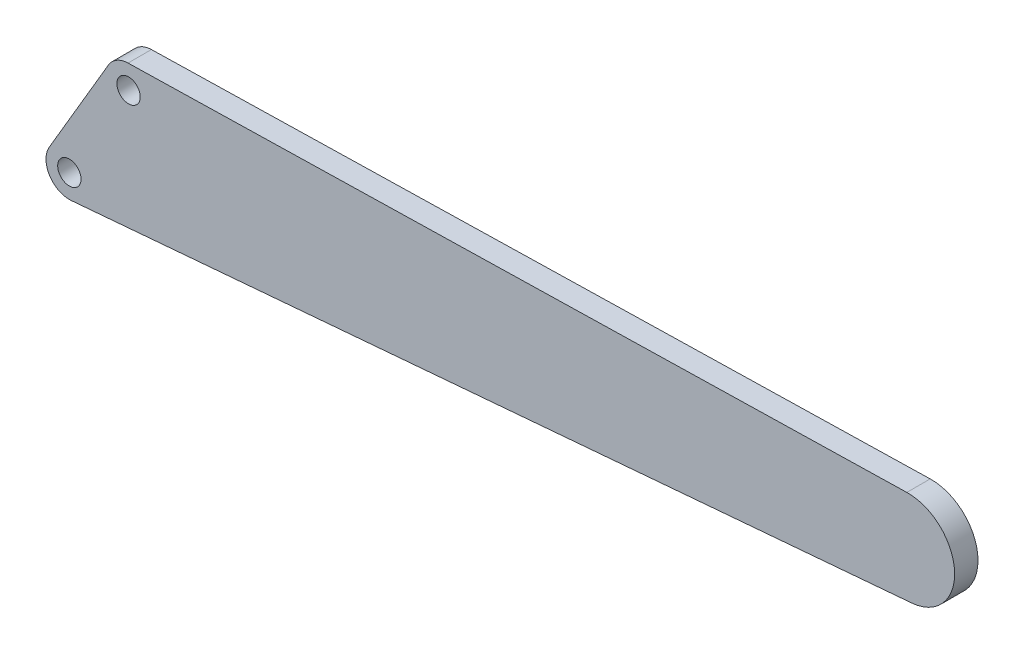
ISO-10303-21;
HEADER;
FILE_DESCRIPTION(('STEP AP214'),'2;1');
FILE_NAME('part.step','',(''),(''),'','','');
FILE_SCHEMA(('AUTOMOTIVE_DESIGN { 1 0 10303 214 1 1 1 1 }'));
ENDSEC;
DATA;
#1=APPLICATION_CONTEXT('core data for automotive mechanical design processes');
#2=APPLICATION_PROTOCOL_DEFINITION('international standard','automotive_design',2000,#1);
#3=PRODUCT_CONTEXT('',#1,'mechanical');
#4=PRODUCT('Part','Part','',(#3));
#5=PRODUCT_RELATED_PRODUCT_CATEGORY('part','',(#4));
#6=PRODUCT_DEFINITION_FORMATION('','',#4);
#7=PRODUCT_DEFINITION_CONTEXT('part definition',#1,'design');
#8=PRODUCT_DEFINITION('design','',#6,#7);
#9=PRODUCT_DEFINITION_SHAPE('','',#8);
#10=(LENGTH_UNIT() NAMED_UNIT(*) SI_UNIT(.MILLI.,.METRE.));
#11=(NAMED_UNIT(*) PLANE_ANGLE_UNIT() SI_UNIT($,.RADIAN.));
#12=(NAMED_UNIT(*) SI_UNIT($,.STERADIAN.) SOLID_ANGLE_UNIT());
#13=UNCERTAINTY_MEASURE_WITH_UNIT(LENGTH_MEASURE(1.E-05),#10,'distance_accuracy_value','');
#14=(GEOMETRIC_REPRESENTATION_CONTEXT(3) GLOBAL_UNCERTAINTY_ASSIGNED_CONTEXT((#13)) GLOBAL_UNIT_ASSIGNED_CONTEXT((#10,
#11,#12)) REPRESENTATION_CONTEXT('',''));
#15=CARTESIAN_POINT('',(0.,0.,0.));
#16=DIRECTION('',(0.,0.,1.));
#17=DIRECTION('',(1.,0.,0.));
#18=AXIS2_PLACEMENT_3D('',#15,#16,#17);
#19=CARTESIAN_POINT('',(0.,0.,3.));
#20=DIRECTION('',(0.,0.,1.));
#21=DIRECTION('',(1.,0.,0.));
#22=AXIS2_PLACEMENT_3D('',#19,#20,#21);
#23=PLANE('',#22);
#24=CARTESIAN_POINT('',(-7.59679952394698,-12.9340108625654,3.));
#25=DIRECTION('',(0.,0.,1.));
#26=DIRECTION('',(1.,0.,0.));
#27=AXIS2_PLACEMENT_3D('',#24,#25,#26);
#28=CIRCLE('',#27,1.5);
#29=CARTESIAN_POINT('',(-6.09679952394698,-12.9340108625654,3.));
#30=VERTEX_POINT('',#29);
#31=EDGE_CURVE('E125',#30,#30,#28,.T.);
#32=ORIENTED_EDGE('',*,*,#31,.F.);
#33=EDGE_LOOP('',(#32));
#34=FACE_BOUND('',#33,.T.);
#35=CARTESIAN_POINT('',(0.,0.,3.));
#36=DIRECTION('',(0.,0.,1.));
#37=DIRECTION('',(1.,0.,0.));
#38=AXIS2_PLACEMENT_3D('',#35,#36,#37);
#39=CIRCLE('',#38,3.);
#40=CARTESIAN_POINT('',(-0.0676018753305609,2.99923823436082,3.));
#41=VERTEX_POINT('',#40);
#42=CARTESIAN_POINT('',(-2.58680217251307,1.5193599047894,3.));
#43=VERTEX_POINT('',#42);
#44=EDGE_CURVE('E132',#41,#43,#39,.T.);
#45=ORIENTED_EDGE('',*,*,#44,.T.);
#46=DIRECTION('',(-0.506453301596465,-0.862267390837691,0.));
#47=VECTOR('',#46,1.);
#48=CARTESIAN_POINT('',(-10.1836016964601,-11.414650957776,3.));
#49=LINE('',#48,#47);
#50=CARTESIAN_POINT('',(-10.1836016964601,-11.414650957776,3.));
#51=VERTEX_POINT('',#50);
#52=EDGE_CURVE('E90',#43,#51,#49,.T.);
#53=ORIENTED_EDGE('',*,*,#52,.T.);
#54=CARTESIAN_POINT('',(-7.59679952394698,-12.9340108625654,3.));
#55=DIRECTION('',(0.,0.,1.));
#56=DIRECTION('',(1.,0.,0.));
#57=AXIS2_PLACEMENT_3D('',#54,#55,#56);
#58=CIRCLE('',#57,3.);
#59=CARTESIAN_POINT('',(-7.34187179294178,-15.9231598805912,3.));
#60=VERTEX_POINT('',#59);
#61=EDGE_CURVE('E103',#51,#60,#58,.T.);
#62=ORIENTED_EDGE('',*,*,#61,.T.);
#63=DIRECTION('',(0.996383006008596,0.0849759103350688,0.));
#64=VECTOR('',#63,1.);
#65=CARTESIAN_POINT('',(100.50985546201,-6.72509181898067,3.));
#66=LINE('',#65,#64);
#67=CARTESIAN_POINT('',(100.50985546201,-6.72509181898068,3.));
#68=VERTEX_POINT('',#67);
#69=EDGE_CURVE('E97',#60,#68,#66,.T.);
#70=ORIENTED_EDGE('',*,*,#69,.T.);
#71=CARTESIAN_POINT('',(100.,-0.746793782929099,3.));
#72=DIRECTION('',(0.,0.,1.));
#73=DIRECTION('',(1.,0.,0.));
#74=AXIS2_PLACEMENT_3D('',#71,#72,#73);
#75=CIRCLE('',#74,6.);
#76=CARTESIAN_POINT('',(99.8647962493389,5.25168268579253,3.));
#77=VERTEX_POINT('',#76);
#78=EDGE_CURVE('E101',#68,#77,#75,.T.);
#79=ORIENTED_EDGE('',*,*,#78,.T.);
#80=DIRECTION('',(-0.999746078120272,-0.0225339584435203,0.));
#81=VECTOR('',#80,1.);
#82=CARTESIAN_POINT('',(-0.0676018753305609,2.99923823436082,3.));
#83=LINE('',#82,#81);
#84=EDGE_CURVE('E53',#77,#41,#83,.T.);
#85=ORIENTED_EDGE('',*,*,#84,.T.);
#86=EDGE_LOOP('',(#45,#53,#62,#70,#79,#85));
#87=FACE_BOUND('',#86,.T.);
#88=CARTESIAN_POINT('',(0.,0.,3.));
#89=DIRECTION('',(0.,0.,1.));
#90=DIRECTION('',(1.,0.,0.));
#91=AXIS2_PLACEMENT_3D('',#88,#89,#90);
#92=CIRCLE('',#91,1.5);
#93=CARTESIAN_POINT('',(1.5,0.,3.));
#94=VERTEX_POINT('',#93);
#95=EDGE_CURVE('E174',#94,#94,#92,.T.);
#96=ORIENTED_EDGE('',*,*,#95,.F.);
#97=EDGE_LOOP('',(#96));
#98=FACE_BOUND('',#97,.T.);
#99=ADVANCED_FACE('F36',(#34,#87,#98),#23,.T.);
#100=CARTESIAN_POINT('',(0.,0.,0.));
#101=DIRECTION('',(0.,0.,1.));
#102=DIRECTION('',(1.,0.,0.));
#103=AXIS2_PLACEMENT_3D('',#100,#101,#102);
#104=PLANE('',#103);
#105=CARTESIAN_POINT('',(0.,0.,0.));
#106=DIRECTION('',(0.,0.,1.));
#107=DIRECTION('',(1.,0.,0.));
#108=AXIS2_PLACEMENT_3D('',#105,#106,#107);
#109=CIRCLE('',#108,3.);
#110=CARTESIAN_POINT('',(-0.0676018753305609,2.99923823436082,0.));
#111=VERTEX_POINT('',#110);
#112=CARTESIAN_POINT('',(-2.58680217251307,1.5193599047894,0.));
#113=VERTEX_POINT('',#112);
#114=EDGE_CURVE('E121',#111,#113,#109,.T.);
#115=ORIENTED_EDGE('',*,*,#114,.F.);
#116=DIRECTION('',(-0.999746078120272,-0.0225339584435203,0.));
#117=VECTOR('',#116,1.);
#118=CARTESIAN_POINT('',(-0.0676018753305609,2.99923823436082,0.));
#119=LINE('',#118,#117);
#120=CARTESIAN_POINT('',(99.8647962493389,5.25168268579253,0.));
#121=VERTEX_POINT('',#120);
#122=EDGE_CURVE('E82',#121,#111,#119,.T.);
#123=ORIENTED_EDGE('',*,*,#122,.F.);
#124=CARTESIAN_POINT('',(100.,-0.746793782929099,0.));
#125=DIRECTION('',(0.,0.,1.));
#126=DIRECTION('',(1.,0.,0.));
#127=AXIS2_PLACEMENT_3D('',#124,#125,#126);
#128=CIRCLE('',#127,6.);
#129=CARTESIAN_POINT('',(100.50985546201,-6.72509181898068,0.));
#130=VERTEX_POINT('',#129);
#131=EDGE_CURVE('E76',#130,#121,#128,.T.);
#132=ORIENTED_EDGE('',*,*,#131,.F.);
#133=DIRECTION('',(0.996383006008596,0.0849759103350688,0.));
#134=VECTOR('',#133,1.);
#135=CARTESIAN_POINT('',(100.50985546201,-6.72509181898067,0.));
#136=LINE('',#135,#134);
#137=CARTESIAN_POINT('',(-7.34187179294178,-15.9231598805912,0.));
#138=VERTEX_POINT('',#137);
#139=EDGE_CURVE('E111',#138,#130,#136,.T.);
#140=ORIENTED_EDGE('',*,*,#139,.F.);
#141=CARTESIAN_POINT('',(-7.59679952394698,-12.9340108625654,0.));
#142=DIRECTION('',(0.,0.,1.));
#143=DIRECTION('',(1.,0.,0.));
#144=AXIS2_PLACEMENT_3D('',#141,#142,#143);
#145=CIRCLE('',#144,3.);
#146=CARTESIAN_POINT('',(-10.1836016964601,-11.414650957776,0.));
#147=VERTEX_POINT('',#146);
#148=EDGE_CURVE('E127',#147,#138,#145,.T.);
#149=ORIENTED_EDGE('',*,*,#148,.F.);
#150=DIRECTION('',(-0.506453301596465,-0.862267390837691,0.));
#151=VECTOR('',#150,1.);
#152=CARTESIAN_POINT('',(-10.1836016964601,-11.414650957776,0.));
#153=LINE('',#152,#151);
#154=EDGE_CURVE('E124',#113,#147,#153,.T.);
#155=ORIENTED_EDGE('',*,*,#154,.F.);
#156=EDGE_LOOP('',(#115,#123,#132,#140,#149,#155));
#157=FACE_BOUND('',#156,.T.);
#158=CARTESIAN_POINT('',(-7.59679952394698,-12.9340108625654,0.));
#159=DIRECTION('',(0.,0.,1.));
#160=DIRECTION('',(1.,0.,0.));
#161=AXIS2_PLACEMENT_3D('',#158,#159,#160);
#162=CIRCLE('',#161,1.5);
#163=CARTESIAN_POINT('',(-6.09679952394698,-12.9340108625654,0.));
#164=VERTEX_POINT('',#163);
#165=EDGE_CURVE('E180',#164,#164,#162,.T.);
#166=ORIENTED_EDGE('',*,*,#165,.T.);
#167=EDGE_LOOP('',(#166));
#168=FACE_BOUND('',#167,.T.);
#169=CARTESIAN_POINT('',(0.,0.,0.));
#170=DIRECTION('',(0.,0.,1.));
#171=DIRECTION('',(1.,0.,0.));
#172=AXIS2_PLACEMENT_3D('',#169,#170,#171);
#173=CIRCLE('',#172,1.5);
#174=CARTESIAN_POINT('',(1.5,0.,0.));
#175=VERTEX_POINT('',#174);
#176=EDGE_CURVE('E177',#175,#175,#173,.T.);
#177=ORIENTED_EDGE('',*,*,#176,.T.);
#178=EDGE_LOOP('',(#177));
#179=FACE_BOUND('',#178,.T.);
#180=ADVANCED_FACE('F141',(#157,#168,#179),#104,.F.);
#181=CARTESIAN_POINT('',(0.,0.,3.));
#182=DIRECTION('',(0.,0.,-1.));
#183=DIRECTION('',(-1.,0.,0.));
#184=AXIS2_PLACEMENT_3D('',#181,#182,#183);
#185=CYLINDRICAL_SURFACE('',#184,3.);
#186=ORIENTED_EDGE('',*,*,#114,.T.);
#187=DIRECTION('',(0.,0.,-1.));
#188=VECTOR('',#187,1.);
#189=CARTESIAN_POINT('',(-2.58680217251307,1.5193599047894,3.));
#190=LINE('',#189,#188);
#191=EDGE_CURVE('E11',#43,#113,#190,.T.);
#192=ORIENTED_EDGE('',*,*,#191,.F.);
#193=ORIENTED_EDGE('',*,*,#44,.F.);
#194=DIRECTION('',(0.,0.,-1.));
#195=VECTOR('',#194,1.);
#196=CARTESIAN_POINT('',(-0.0676018753305609,2.99923823436082,3.));
#197=LINE('',#196,#195);
#198=EDGE_CURVE('E117',#41,#111,#197,.T.);
#199=ORIENTED_EDGE('',*,*,#198,.T.);
#200=EDGE_LOOP('',(#186,#192,#193,#199));
#201=FACE_BOUND('',#200,.T.);
#202=ADVANCED_FACE('F38',(#201),#185,.T.);
#203=CARTESIAN_POINT('',(-10.1836016964601,-11.414650957776,3.));
#204=DIRECTION('',(0.862267390837691,-0.506453301596465,0.));
#205=DIRECTION('',(0.506453301596465,0.862267390837691,0.));
#206=AXIS2_PLACEMENT_3D('',#203,#204,#205);
#207=PLANE('',#206);
#208=ORIENTED_EDGE('',*,*,#154,.T.);
#209=DIRECTION('',(0.,0.,-1.));
#210=VECTOR('',#209,1.);
#211=CARTESIAN_POINT('',(-10.1836016964601,-11.414650957776,3.));
#212=LINE('',#211,#210);
#213=EDGE_CURVE('E45',#51,#147,#212,.T.);
#214=ORIENTED_EDGE('',*,*,#213,.F.);
#215=ORIENTED_EDGE('',*,*,#52,.F.);
#216=ORIENTED_EDGE('',*,*,#191,.T.);
#217=EDGE_LOOP('',(#208,#214,#215,#216));
#218=FACE_BOUND('',#217,.T.);
#219=ADVANCED_FACE('F221',(#218),#207,.F.);
#220=CARTESIAN_POINT('',(-7.59679952394698,-12.9340108625654,3.));
#221=DIRECTION('',(0.,0.,-1.));
#222=DIRECTION('',(-1.,0.,0.));
#223=AXIS2_PLACEMENT_3D('',#220,#221,#222);
#224=CYLINDRICAL_SURFACE('',#223,3.);
#225=ORIENTED_EDGE('',*,*,#148,.T.);
#226=DIRECTION('',(0.,0.,-1.));
#227=VECTOR('',#226,1.);
#228=CARTESIAN_POINT('',(-7.34187179294178,-15.9231598805912,3.));
#229=LINE('',#228,#227);
#230=EDGE_CURVE('E112',#60,#138,#229,.T.);
#231=ORIENTED_EDGE('',*,*,#230,.F.);
#232=ORIENTED_EDGE('',*,*,#61,.F.);
#233=ORIENTED_EDGE('',*,*,#213,.T.);
#234=EDGE_LOOP('',(#225,#231,#232,#233));
#235=FACE_BOUND('',#234,.T.);
#236=ADVANCED_FACE('F138',(#235),#224,.T.);
#237=CARTESIAN_POINT('',(100.50985546201,-6.72509181898067,3.));
#238=DIRECTION('',(-0.0849759103350688,0.996383006008596,0.));
#239=DIRECTION('',(-0.996383006008596,-0.0849759103350688,0.));
#240=AXIS2_PLACEMENT_3D('',#237,#238,#239);
#241=PLANE('',#240);
#242=ORIENTED_EDGE('',*,*,#139,.T.);
#243=DIRECTION('',(0.,0.,-1.));
#244=VECTOR('',#243,1.);
#245=CARTESIAN_POINT('',(100.50985546201,-6.72509181898068,3.));
#246=LINE('',#245,#244);
#247=EDGE_CURVE('E108',#68,#130,#246,.T.);
#248=ORIENTED_EDGE('',*,*,#247,.F.);
#249=ORIENTED_EDGE('',*,*,#69,.F.);
#250=ORIENTED_EDGE('',*,*,#230,.T.);
#251=EDGE_LOOP('',(#242,#248,#249,#250));
#252=FACE_BOUND('',#251,.T.);
#253=ADVANCED_FACE('F109',(#252),#241,.F.);
#254=CARTESIAN_POINT('',(100.,-0.746793782929099,3.));
#255=DIRECTION('',(0.,0.,-1.));
#256=DIRECTION('',(-1.,0.,0.));
#257=AXIS2_PLACEMENT_3D('',#254,#255,#256);
#258=CYLINDRICAL_SURFACE('',#257,6.);
#259=ORIENTED_EDGE('',*,*,#131,.T.);
#260=DIRECTION('',(0.,0.,-1.));
#261=VECTOR('',#260,1.);
#262=CARTESIAN_POINT('',(99.8647962493389,5.25168268579253,3.));
#263=LINE('',#262,#261);
#264=EDGE_CURVE('E113',#77,#121,#263,.T.);
#265=ORIENTED_EDGE('',*,*,#264,.F.);
#266=ORIENTED_EDGE('',*,*,#78,.F.);
#267=ORIENTED_EDGE('',*,*,#247,.T.);
#268=EDGE_LOOP('',(#259,#265,#266,#267));
#269=FACE_BOUND('',#268,.T.);
#270=ADVANCED_FACE('F115',(#269),#258,.T.);
#271=CARTESIAN_POINT('',(-0.0676018753305609,2.99923823436082,3.));
#272=DIRECTION('',(0.0225339584435203,-0.999746078120272,0.));
#273=DIRECTION('',(0.999746078120272,0.0225339584435203,0.));
#274=AXIS2_PLACEMENT_3D('',#271,#272,#273);
#275=PLANE('',#274);
#276=ORIENTED_EDGE('',*,*,#122,.T.);
#277=ORIENTED_EDGE('',*,*,#198,.F.);
#278=ORIENTED_EDGE('',*,*,#84,.F.);
#279=ORIENTED_EDGE('',*,*,#264,.T.);
#280=EDGE_LOOP('',(#276,#277,#278,#279));
#281=FACE_BOUND('',#280,.T.);
#282=ADVANCED_FACE('F146',(#281),#275,.F.);
#283=CARTESIAN_POINT('',(-7.59679952394698,-12.9340108625654,3.));
#284=DIRECTION('',(0.,0.,-1.));
#285=DIRECTION('',(-1.,0.,0.));
#286=AXIS2_PLACEMENT_3D('',#283,#284,#285);
#287=CYLINDRICAL_SURFACE('',#286,1.5);
#288=ORIENTED_EDGE('',*,*,#31,.T.);
#289=EDGE_LOOP('',(#288));
#290=FACE_BOUND('',#289,.T.);
#291=ORIENTED_EDGE('',*,*,#165,.F.);
#292=EDGE_LOOP('',(#291));
#293=FACE_BOUND('',#292,.T.);
#294=ADVANCED_FACE('F148',(#290,#293),#287,.F.);
#295=CARTESIAN_POINT('',(0.,0.,3.));
#296=DIRECTION('',(0.,0.,-1.));
#297=DIRECTION('',(-1.,0.,0.));
#298=AXIS2_PLACEMENT_3D('',#295,#296,#297);
#299=CYLINDRICAL_SURFACE('',#298,1.5);
#300=ORIENTED_EDGE('',*,*,#95,.T.);
#301=EDGE_LOOP('',(#300));
#302=FACE_BOUND('',#301,.T.);
#303=ORIENTED_EDGE('',*,*,#176,.F.);
#304=EDGE_LOOP('',(#303));
#305=FACE_BOUND('',#304,.T.);
#306=ADVANCED_FACE('F154',(#302,#305),#299,.F.);
#307=CLOSED_SHELL('',(#99,#180,#202,#219,#236,#253,#270,#282,#294,#306));
#308=MANIFOLD_SOLID_BREP('B2',#307);
#309=ADVANCED_BREP_SHAPE_REPRESENTATION('',(#18,#308),#14);
#310=SHAPE_DEFINITION_REPRESENTATION(#9,#309);
ENDSEC;
END-ISO-10303-21;
